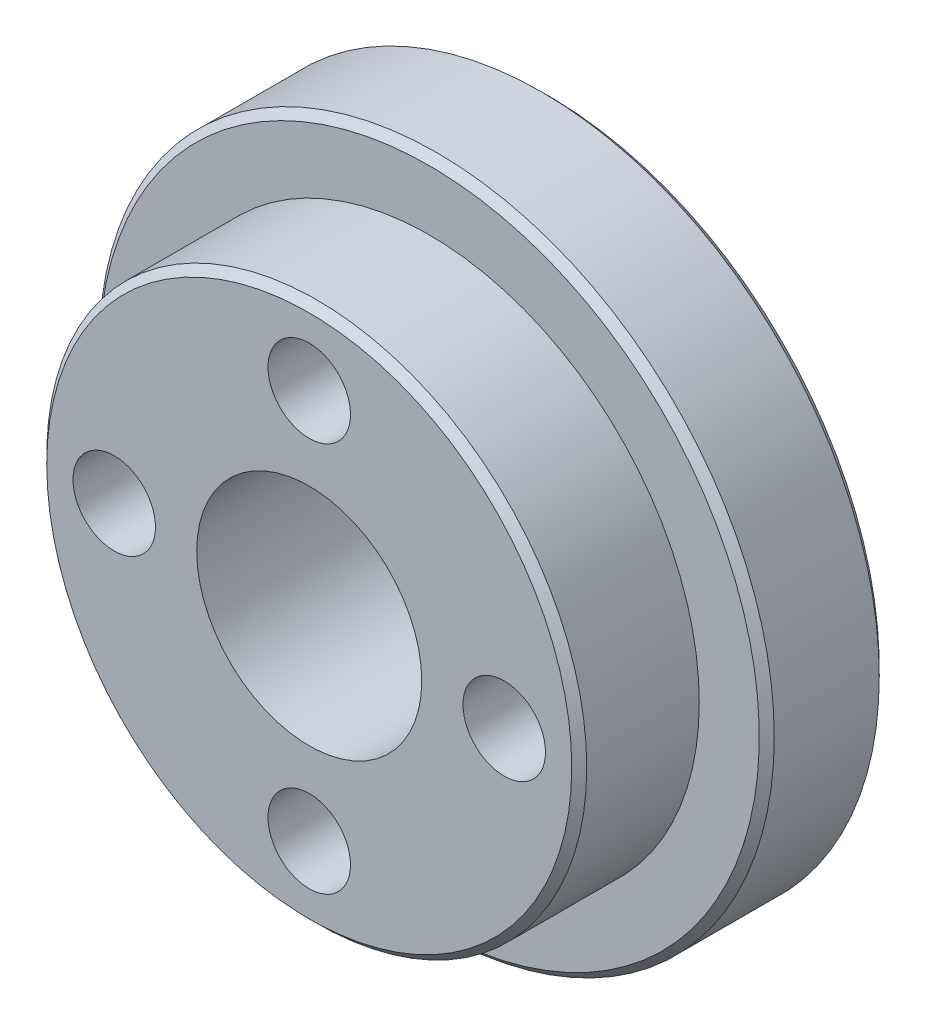
ISO-10303-21;
HEADER;
FILE_DESCRIPTION(('STEP AP214'),'2;1');
FILE_NAME('part.step','',(''),(''),'','','');
FILE_SCHEMA(('AUTOMOTIVE_DESIGN { 1 0 10303 214 1 1 1 1 }'));
ENDSEC;
DATA;
#1=APPLICATION_CONTEXT('core data for automotive mechanical design processes');
#2=APPLICATION_PROTOCOL_DEFINITION('international standard','automotive_design',2000,#1);
#3=PRODUCT_CONTEXT('',#1,'mechanical');
#4=PRODUCT('Part','Part','',(#3));
#5=PRODUCT_RELATED_PRODUCT_CATEGORY('part','',(#4));
#6=PRODUCT_DEFINITION_FORMATION('','',#4);
#7=PRODUCT_DEFINITION_CONTEXT('part definition',#1,'design');
#8=PRODUCT_DEFINITION('design','',#6,#7);
#9=PRODUCT_DEFINITION_SHAPE('','',#8);
#10=(LENGTH_UNIT() NAMED_UNIT(*) SI_UNIT(.MILLI.,.METRE.));
#11=(NAMED_UNIT(*) PLANE_ANGLE_UNIT() SI_UNIT($,.RADIAN.));
#12=(NAMED_UNIT(*) SI_UNIT($,.STERADIAN.) SOLID_ANGLE_UNIT());
#13=UNCERTAINTY_MEASURE_WITH_UNIT(LENGTH_MEASURE(1.E-05),#10,'distance_accuracy_value','');
#14=(GEOMETRIC_REPRESENTATION_CONTEXT(3) GLOBAL_UNCERTAINTY_ASSIGNED_CONTEXT((#13)) GLOBAL_UNIT_ASSIGNED_CONTEXT((#10,
#11,#12)) REPRESENTATION_CONTEXT('',''));
#15=CARTESIAN_POINT('',(0.,0.,0.));
#16=DIRECTION('',(0.,0.,1.));
#17=DIRECTION('',(1.,0.,0.));
#18=AXIS2_PLACEMENT_3D('',#15,#16,#17);
#19=CARTESIAN_POINT('',(0.,0.,8.));
#20=DIRECTION('',(0.,0.,-1.));
#21=DIRECTION('',(-1.,0.,0.));
#22=AXIS2_PLACEMENT_3D('',#19,#20,#21);
#23=CYLINDRICAL_SURFACE('',#22,18.);
#24=CARTESIAN_POINT('',(0.,0.,7.5));
#25=DIRECTION('',(0.,0.,1.));
#26=DIRECTION('',(1.,0.,0.));
#27=AXIS2_PLACEMENT_3D('',#24,#25,#26);
#28=CIRCLE('',#27,18.);
#29=CARTESIAN_POINT('',(18.,0.,7.5));
#30=VERTEX_POINT('',#29);
#31=EDGE_CURVE('E10',#30,#30,#28,.F.);
#32=ORIENTED_EDGE('',*,*,#31,.T.);
#33=EDGE_LOOP('',(#32));
#34=FACE_BOUND('',#33,.T.);
#35=CARTESIAN_POINT('',(0.,0.,0.));
#36=DIRECTION('',(0.,0.,1.));
#37=DIRECTION('',(1.,0.,0.));
#38=AXIS2_PLACEMENT_3D('',#35,#36,#37);
#39=CIRCLE('',#38,18.);
#40=CARTESIAN_POINT('',(18.,0.,0.));
#41=VERTEX_POINT('',#40);
#42=EDGE_CURVE('E63',#41,#41,#39,.T.);
#43=ORIENTED_EDGE('',*,*,#42,.T.);
#44=EDGE_LOOP('',(#43));
#45=FACE_BOUND('',#44,.T.);
#46=ADVANCED_FACE('F36',(#34,#45),#23,.T.);
#47=CARTESIAN_POINT('',(0.,0.,8.));
#48=DIRECTION('',(0.,0.,1.));
#49=DIRECTION('',(1.,0.,0.));
#50=AXIS2_PLACEMENT_3D('',#47,#48,#49);
#51=PLANE('',#50);
#52=CARTESIAN_POINT('',(-13.,1.36167772214882E-13,8.));
#53=DIRECTION('',(0.,0.,1.));
#54=DIRECTION('',(1.,0.,0.));
#55=AXIS2_PLACEMENT_3D('',#52,#53,#54);
#56=CIRCLE('',#55,2.75);
#57=CARTESIAN_POINT('',(-10.25,1.36167772214882E-13,8.));
#58=VERTEX_POINT('',#57);
#59=EDGE_CURVE('E108',#58,#58,#56,.T.);
#60=ORIENTED_EDGE('',*,*,#59,.F.);
#61=EDGE_LOOP('',(#60));
#62=FACE_BOUND('',#61,.T.);
#63=CARTESIAN_POINT('',(0.,-13.,8.));
#64=DIRECTION('',(0.,0.,1.));
#65=DIRECTION('',(1.,0.,0.));
#66=AXIS2_PLACEMENT_3D('',#63,#64,#65);
#67=CIRCLE('',#66,2.75);
#68=CARTESIAN_POINT('',(2.75,-13.,8.));
#69=VERTEX_POINT('',#68);
#70=EDGE_CURVE('E96',#69,#69,#67,.T.);
#71=ORIENTED_EDGE('',*,*,#70,.F.);
#72=EDGE_LOOP('',(#71));
#73=FACE_BOUND('',#72,.T.);
#74=CARTESIAN_POINT('',(13.,0.,8.));
#75=DIRECTION('',(0.,0.,1.));
#76=DIRECTION('',(1.,0.,0.));
#77=AXIS2_PLACEMENT_3D('',#74,#75,#76);
#78=CIRCLE('',#77,2.75);
#79=CARTESIAN_POINT('',(15.75,0.,8.));
#80=VERTEX_POINT('',#79);
#81=EDGE_CURVE('E84',#80,#80,#78,.T.);
#82=ORIENTED_EDGE('',*,*,#81,.F.);
#83=EDGE_LOOP('',(#82));
#84=FACE_BOUND('',#83,.T.);
#85=CARTESIAN_POINT('',(0.,13.,8.));
#86=DIRECTION('',(0.,0.,1.));
#87=DIRECTION('',(1.,0.,0.));
#88=AXIS2_PLACEMENT_3D('',#85,#86,#87);
#89=CIRCLE('',#88,2.75);
#90=CARTESIAN_POINT('',(2.75,13.,8.));
#91=VERTEX_POINT('',#90);
#92=EDGE_CURVE('E70',#91,#91,#89,.T.);
#93=ORIENTED_EDGE('',*,*,#92,.F.);
#94=EDGE_LOOP('',(#93));
#95=FACE_BOUND('',#94,.T.);
#96=CARTESIAN_POINT('',(0.,0.,8.));
#97=DIRECTION('',(0.,0.,-1.));
#98=DIRECTION('',(-1.,0.,0.));
#99=AXIS2_PLACEMENT_3D('',#96,#97,#98);
#100=CIRCLE('',#99,7.5);
#101=CARTESIAN_POINT('',(-7.5,0.,8.));
#102=VERTEX_POINT('',#101);
#103=EDGE_CURVE('E66',#102,#102,#100,.T.);
#104=ORIENTED_EDGE('',*,*,#103,.T.);
#105=EDGE_LOOP('',(#104));
#106=FACE_BOUND('',#105,.T.);
#107=CARTESIAN_POINT('',(0.,0.,8.));
#108=DIRECTION('',(0.,0.,1.));
#109=DIRECTION('',(1.,0.,0.));
#110=AXIS2_PLACEMENT_3D('',#107,#108,#109);
#111=CIRCLE('',#110,17.5);
#112=CARTESIAN_POINT('',(17.5,0.,8.));
#113=VERTEX_POINT('',#112);
#114=EDGE_CURVE('E44',#113,#113,#111,.T.);
#115=ORIENTED_EDGE('',*,*,#114,.T.);
#116=EDGE_LOOP('',(#115));
#117=FACE_BOUND('',#116,.T.);
#118=ADVANCED_FACE('F155',(#62,#73,#84,#95,#106,#117),#51,.T.);
#119=CARTESIAN_POINT('',(0.,0.,-8.));
#120=DIRECTION('',(0.,0.,1.));
#121=DIRECTION('',(1.,0.,0.));
#122=AXIS2_PLACEMENT_3D('',#119,#120,#121);
#123=CYLINDRICAL_SURFACE('',#122,22.5);
#124=CARTESIAN_POINT('',(0.,0.,-7.5));
#125=DIRECTION('',(0.,0.,-1.));
#126=DIRECTION('',(-1.,0.,0.));
#127=AXIS2_PLACEMENT_3D('',#124,#125,#126);
#128=CIRCLE('',#127,22.5);
#129=CARTESIAN_POINT('',(-22.5,0.,-7.5));
#130=VERTEX_POINT('',#129);
#131=EDGE_CURVE('E52',#130,#130,#128,.F.);
#132=ORIENTED_EDGE('',*,*,#131,.T.);
#133=EDGE_LOOP('',(#132));
#134=FACE_BOUND('',#133,.T.);
#135=CARTESIAN_POINT('',(0.,0.,-0.5));
#136=DIRECTION('',(0.,0.,-1.));
#137=DIRECTION('',(-1.,0.,0.));
#138=AXIS2_PLACEMENT_3D('',#135,#136,#137);
#139=CIRCLE('',#138,22.5);
#140=CARTESIAN_POINT('',(-22.5,0.,-0.5));
#141=VERTEX_POINT('',#140);
#142=EDGE_CURVE('E57',#141,#141,#139,.T.);
#143=ORIENTED_EDGE('',*,*,#142,.T.);
#144=EDGE_LOOP('',(#143));
#145=FACE_BOUND('',#144,.T.);
#146=ADVANCED_FACE('F127',(#134,#145),#123,.T.);
#147=CARTESIAN_POINT('',(0.,0.,-8.));
#148=DIRECTION('',(0.,0.,-1.));
#149=DIRECTION('',(-1.,0.,0.));
#150=AXIS2_PLACEMENT_3D('',#147,#148,#149);
#151=PLANE('',#150);
#152=CARTESIAN_POINT('',(-13.,1.36167772214882E-13,-8.));
#153=DIRECTION('',(0.,0.,-1.));
#154=DIRECTION('',(-1.,0.,0.));
#155=AXIS2_PLACEMENT_3D('',#152,#153,#154);
#156=CIRCLE('',#155,4.5);
#157=CARTESIAN_POINT('',(-17.5,1.36167772214882E-13,-8.));
#158=VERTEX_POINT('',#157);
#159=EDGE_CURVE('E117',#158,#158,#156,.T.);
#160=ORIENTED_EDGE('',*,*,#159,.F.);
#161=EDGE_LOOP('',(#160));
#162=FACE_BOUND('',#161,.T.);
#163=CARTESIAN_POINT('',(0.,-13.,-8.));
#164=DIRECTION('',(0.,0.,-1.));
#165=DIRECTION('',(-1.,0.,0.));
#166=AXIS2_PLACEMENT_3D('',#163,#164,#165);
#167=CIRCLE('',#166,4.5);
#168=CARTESIAN_POINT('',(-4.5,-13.,-8.));
#169=VERTEX_POINT('',#168);
#170=EDGE_CURVE('E105',#169,#169,#167,.T.);
#171=ORIENTED_EDGE('',*,*,#170,.F.);
#172=EDGE_LOOP('',(#171));
#173=FACE_BOUND('',#172,.T.);
#174=CARTESIAN_POINT('',(13.,0.,-8.));
#175=DIRECTION('',(0.,0.,-1.));
#176=DIRECTION('',(-1.,0.,0.));
#177=AXIS2_PLACEMENT_3D('',#174,#175,#176);
#178=CIRCLE('',#177,4.5);
#179=CARTESIAN_POINT('',(8.5,0.,-8.));
#180=VERTEX_POINT('',#179);
#181=EDGE_CURVE('E93',#180,#180,#178,.T.);
#182=ORIENTED_EDGE('',*,*,#181,.F.);
#183=EDGE_LOOP('',(#182));
#184=FACE_BOUND('',#183,.T.);
#185=CARTESIAN_POINT('',(0.,13.,-8.));
#186=DIRECTION('',(0.,0.,-1.));
#187=DIRECTION('',(-1.,0.,0.));
#188=AXIS2_PLACEMENT_3D('',#185,#186,#187);
#189=CIRCLE('',#188,4.5);
#190=CARTESIAN_POINT('',(-4.5,13.,-8.));
#191=VERTEX_POINT('',#190);
#192=EDGE_CURVE('E81',#191,#191,#189,.T.);
#193=ORIENTED_EDGE('',*,*,#192,.F.);
#194=EDGE_LOOP('',(#193));
#195=FACE_BOUND('',#194,.T.);
#196=CARTESIAN_POINT('',(0.,0.,-8.));
#197=DIRECTION('',(0.,0.,-1.));
#198=DIRECTION('',(-1.,0.,0.));
#199=AXIS2_PLACEMENT_3D('',#196,#197,#198);
#200=CIRCLE('',#199,7.5);
#201=CARTESIAN_POINT('',(-7.5,0.,-8.));
#202=VERTEX_POINT('',#201);
#203=EDGE_CURVE('E67',#202,#202,#200,.T.);
#204=ORIENTED_EDGE('',*,*,#203,.F.);
#205=EDGE_LOOP('',(#204));
#206=FACE_BOUND('',#205,.T.);
#207=CARTESIAN_POINT('',(0.,0.,-8.));
#208=DIRECTION('',(0.,0.,-1.));
#209=DIRECTION('',(-1.,0.,0.));
#210=AXIS2_PLACEMENT_3D('',#207,#208,#209);
#211=CIRCLE('',#210,22.);
#212=CARTESIAN_POINT('',(-22.,0.,-8.));
#213=VERTEX_POINT('',#212);
#214=EDGE_CURVE('E60',#213,#213,#211,.T.);
#215=ORIENTED_EDGE('',*,*,#214,.T.);
#216=EDGE_LOOP('',(#215));
#217=FACE_BOUND('',#216,.T.);
#218=ADVANCED_FACE('F123',(#162,#173,#184,#195,#206,#217),#151,.T.);
#219=CARTESIAN_POINT('',(0.,0.,0.));
#220=DIRECTION('',(0.,0.,-1.));
#221=DIRECTION('',(-1.,0.,0.));
#222=AXIS2_PLACEMENT_3D('',#219,#220,#221);
#223=PLANE('',#222);
#224=CARTESIAN_POINT('',(0.,0.,0.));
#225=DIRECTION('',(0.,0.,-1.));
#226=DIRECTION('',(-1.,0.,0.));
#227=AXIS2_PLACEMENT_3D('',#224,#225,#226);
#228=CIRCLE('',#227,22.);
#229=CARTESIAN_POINT('',(-22.,0.,0.));
#230=VERTEX_POINT('',#229);
#231=EDGE_CURVE('E48',#230,#230,#228,.F.);
#232=ORIENTED_EDGE('',*,*,#231,.T.);
#233=EDGE_LOOP('',(#232));
#234=FACE_BOUND('',#233,.T.);
#235=ORIENTED_EDGE('',*,*,#42,.F.);
#236=EDGE_LOOP('',(#235));
#237=FACE_BOUND('',#236,.T.);
#238=ADVANCED_FACE('F126',(#234,#237),#223,.F.);
#239=CARTESIAN_POINT('',(0.,0.,-8.));
#240=DIRECTION('',(0.,0.,1.));
#241=DIRECTION('',(1.,0.,0.));
#242=AXIS2_PLACEMENT_3D('',#239,#240,#241);
#243=CONICAL_SURFACE('',#242,22.,0.785398163397455);
#244=ORIENTED_EDGE('',*,*,#131,.F.);
#245=EDGE_LOOP('',(#244));
#246=FACE_BOUND('',#245,.T.);
#247=ORIENTED_EDGE('',*,*,#214,.F.);
#248=EDGE_LOOP('',(#247));
#249=FACE_BOUND('',#248,.T.);
#250=ADVANCED_FACE('F139',(#246,#249),#243,.T.);
#251=CARTESIAN_POINT('',(0.,0.,-0.5));
#252=DIRECTION('',(0.,0.,-1.));
#253=DIRECTION('',(-1.,0.,0.));
#254=AXIS2_PLACEMENT_3D('',#251,#252,#253);
#255=CONICAL_SURFACE('',#254,22.5,0.785398163397452);
#256=ORIENTED_EDGE('',*,*,#231,.F.);
#257=EDGE_LOOP('',(#256));
#258=FACE_BOUND('',#257,.T.);
#259=ORIENTED_EDGE('',*,*,#142,.F.);
#260=EDGE_LOOP('',(#259));
#261=FACE_BOUND('',#260,.T.);
#262=ADVANCED_FACE('F141',(#258,#261),#255,.T.);
#263=CARTESIAN_POINT('',(0.,0.,8.));
#264=DIRECTION('',(0.,0.,-1.));
#265=DIRECTION('',(-1.,0.,0.));
#266=AXIS2_PLACEMENT_3D('',#263,#264,#265);
#267=CONICAL_SURFACE('',#266,17.5,0.785398163397441);
#268=ORIENTED_EDGE('',*,*,#31,.F.);
#269=EDGE_LOOP('',(#268));
#270=FACE_BOUND('',#269,.T.);
#271=ORIENTED_EDGE('',*,*,#114,.F.);
#272=EDGE_LOOP('',(#271));
#273=FACE_BOUND('',#272,.T.);
#274=ADVANCED_FACE('F39',(#270,#273),#267,.T.);
#275=CARTESIAN_POINT('',(0.,0.,8.));
#276=DIRECTION('',(0.,0.,-1.));
#277=DIRECTION('',(-1.,0.,0.));
#278=AXIS2_PLACEMENT_3D('',#275,#276,#277);
#279=CYLINDRICAL_SURFACE('',#278,7.5);
#280=ORIENTED_EDGE('',*,*,#103,.F.);
#281=EDGE_LOOP('',(#280));
#282=FACE_BOUND('',#281,.T.);
#283=ORIENTED_EDGE('',*,*,#203,.T.);
#284=EDGE_LOOP('',(#283));
#285=FACE_BOUND('',#284,.T.);
#286=ADVANCED_FACE('F166',(#282,#285),#279,.F.);
#287=CARTESIAN_POINT('',(0.,13.,-8.));
#288=DIRECTION('',(0.,0.,-1.));
#289=DIRECTION('',(-1.,0.,0.));
#290=AXIS2_PLACEMENT_3D('',#287,#288,#289);
#291=CYLINDRICAL_SURFACE('',#290,2.75);
#292=CARTESIAN_POINT('',(0.,13.,-3.));
#293=DIRECTION('',(0.,0.,-1.));
#294=DIRECTION('',(-1.,0.,0.));
#295=AXIS2_PLACEMENT_3D('',#292,#293,#294);
#296=CIRCLE('',#295,2.75);
#297=CARTESIAN_POINT('',(-2.75,13.,-3.));
#298=VERTEX_POINT('',#297);
#299=EDGE_CURVE('E75',#298,#298,#296,.T.);
#300=ORIENTED_EDGE('',*,*,#299,.T.);
#301=EDGE_LOOP('',(#300));
#302=FACE_BOUND('',#301,.T.);
#303=ORIENTED_EDGE('',*,*,#92,.T.);
#304=EDGE_LOOP('',(#303));
#305=FACE_BOUND('',#304,.T.);
#306=ADVANCED_FACE('F169',(#302,#305),#291,.F.);
#307=CARTESIAN_POINT('',(2.75,13.,-3.));
#308=DIRECTION('',(0.,0.,1.));
#309=DIRECTION('',(1.,0.,0.));
#310=AXIS2_PLACEMENT_3D('',#307,#308,#309);
#311=PLANE('',#310);
#312=ORIENTED_EDGE('',*,*,#299,.F.);
#313=EDGE_LOOP('',(#312));
#314=FACE_BOUND('',#313,.T.);
#315=CARTESIAN_POINT('',(0.,13.,-3.));
#316=DIRECTION('',(0.,0.,-1.));
#317=DIRECTION('',(-1.,0.,0.));
#318=AXIS2_PLACEMENT_3D('',#315,#316,#317);
#319=CIRCLE('',#318,4.5);
#320=CARTESIAN_POINT('',(-4.5,13.,-3.));
#321=VERTEX_POINT('',#320);
#322=EDGE_CURVE('E78',#321,#321,#319,.T.);
#323=ORIENTED_EDGE('',*,*,#322,.T.);
#324=EDGE_LOOP('',(#323));
#325=FACE_BOUND('',#324,.T.);
#326=ADVANCED_FACE('F173',(#314,#325),#311,.F.);
#327=CARTESIAN_POINT('',(0.,13.,-8.));
#328=DIRECTION('',(0.,0.,-1.));
#329=DIRECTION('',(-1.,0.,0.));
#330=AXIS2_PLACEMENT_3D('',#327,#328,#329);
#331=CYLINDRICAL_SURFACE('',#330,4.5);
#332=ORIENTED_EDGE('',*,*,#322,.F.);
#333=EDGE_LOOP('',(#332));
#334=FACE_BOUND('',#333,.T.);
#335=ORIENTED_EDGE('',*,*,#192,.T.);
#336=EDGE_LOOP('',(#335));
#337=FACE_BOUND('',#336,.T.);
#338=ADVANCED_FACE('F177',(#334,#337),#331,.F.);
#339=CARTESIAN_POINT('',(13.,0.,-8.));
#340=DIRECTION('',(0.,0.,-1.));
#341=DIRECTION('',(-1.,0.,0.));
#342=AXIS2_PLACEMENT_3D('',#339,#340,#341);
#343=CYLINDRICAL_SURFACE('',#342,2.75);
#344=CARTESIAN_POINT('',(13.,0.,-3.));
#345=DIRECTION('',(0.,0.,-1.));
#346=DIRECTION('',(-1.,0.,0.));
#347=AXIS2_PLACEMENT_3D('',#344,#345,#346);
#348=CIRCLE('',#347,2.75);
#349=CARTESIAN_POINT('',(10.25,0.,-3.));
#350=VERTEX_POINT('',#349);
#351=EDGE_CURVE('E87',#350,#350,#348,.T.);
#352=ORIENTED_EDGE('',*,*,#351,.T.);
#353=EDGE_LOOP('',(#352));
#354=FACE_BOUND('',#353,.T.);
#355=ORIENTED_EDGE('',*,*,#81,.T.);
#356=EDGE_LOOP('',(#355));
#357=FACE_BOUND('',#356,.T.);
#358=ADVANCED_FACE('F181',(#354,#357),#343,.F.);
#359=CARTESIAN_POINT('',(15.75,0.,-3.));
#360=DIRECTION('',(0.,0.,1.));
#361=DIRECTION('',(1.,0.,0.));
#362=AXIS2_PLACEMENT_3D('',#359,#360,#361);
#363=PLANE('',#362);
#364=ORIENTED_EDGE('',*,*,#351,.F.);
#365=EDGE_LOOP('',(#364));
#366=FACE_BOUND('',#365,.T.);
#367=CARTESIAN_POINT('',(13.,0.,-3.));
#368=DIRECTION('',(0.,0.,-1.));
#369=DIRECTION('',(-1.,0.,0.));
#370=AXIS2_PLACEMENT_3D('',#367,#368,#369);
#371=CIRCLE('',#370,4.5);
#372=CARTESIAN_POINT('',(8.5,0.,-3.));
#373=VERTEX_POINT('',#372);
#374=EDGE_CURVE('E90',#373,#373,#371,.T.);
#375=ORIENTED_EDGE('',*,*,#374,.T.);
#376=EDGE_LOOP('',(#375));
#377=FACE_BOUND('',#376,.T.);
#378=ADVANCED_FACE('F185',(#366,#377),#363,.F.);
#379=CARTESIAN_POINT('',(13.,0.,-8.));
#380=DIRECTION('',(0.,0.,-1.));
#381=DIRECTION('',(-1.,0.,0.));
#382=AXIS2_PLACEMENT_3D('',#379,#380,#381);
#383=CYLINDRICAL_SURFACE('',#382,4.5);
#384=ORIENTED_EDGE('',*,*,#374,.F.);
#385=EDGE_LOOP('',(#384));
#386=FACE_BOUND('',#385,.T.);
#387=ORIENTED_EDGE('',*,*,#181,.T.);
#388=EDGE_LOOP('',(#387));
#389=FACE_BOUND('',#388,.T.);
#390=ADVANCED_FACE('F189',(#386,#389),#383,.F.);
#391=CARTESIAN_POINT('',(0.,-13.,-8.));
#392=DIRECTION('',(0.,0.,-1.));
#393=DIRECTION('',(-1.,0.,0.));
#394=AXIS2_PLACEMENT_3D('',#391,#392,#393);
#395=CYLINDRICAL_SURFACE('',#394,2.75);
#396=CARTESIAN_POINT('',(0.,-13.,-3.));
#397=DIRECTION('',(0.,0.,-1.));
#398=DIRECTION('',(-1.,0.,0.));
#399=AXIS2_PLACEMENT_3D('',#396,#397,#398);
#400=CIRCLE('',#399,2.75);
#401=CARTESIAN_POINT('',(-2.75,-13.,-3.));
#402=VERTEX_POINT('',#401);
#403=EDGE_CURVE('E99',#402,#402,#400,.T.);
#404=ORIENTED_EDGE('',*,*,#403,.T.);
#405=EDGE_LOOP('',(#404));
#406=FACE_BOUND('',#405,.T.);
#407=ORIENTED_EDGE('',*,*,#70,.T.);
#408=EDGE_LOOP('',(#407));
#409=FACE_BOUND('',#408,.T.);
#410=ADVANCED_FACE('F193',(#406,#409),#395,.F.);
#411=CARTESIAN_POINT('',(2.75,-13.,-3.));
#412=DIRECTION('',(0.,0.,1.));
#413=DIRECTION('',(1.,0.,0.));
#414=AXIS2_PLACEMENT_3D('',#411,#412,#413);
#415=PLANE('',#414);
#416=ORIENTED_EDGE('',*,*,#403,.F.);
#417=EDGE_LOOP('',(#416));
#418=FACE_BOUND('',#417,.T.);
#419=CARTESIAN_POINT('',(0.,-13.,-3.));
#420=DIRECTION('',(0.,0.,-1.));
#421=DIRECTION('',(-1.,0.,0.));
#422=AXIS2_PLACEMENT_3D('',#419,#420,#421);
#423=CIRCLE('',#422,4.5);
#424=CARTESIAN_POINT('',(-4.5,-13.,-3.));
#425=VERTEX_POINT('',#424);
#426=EDGE_CURVE('E102',#425,#425,#423,.T.);
#427=ORIENTED_EDGE('',*,*,#426,.T.);
#428=EDGE_LOOP('',(#427));
#429=FACE_BOUND('',#428,.T.);
#430=ADVANCED_FACE('F197',(#418,#429),#415,.F.);
#431=CARTESIAN_POINT('',(0.,-13.,-8.));
#432=DIRECTION('',(0.,0.,-1.));
#433=DIRECTION('',(-1.,0.,0.));
#434=AXIS2_PLACEMENT_3D('',#431,#432,#433);
#435=CYLINDRICAL_SURFACE('',#434,4.5);
#436=ORIENTED_EDGE('',*,*,#426,.F.);
#437=EDGE_LOOP('',(#436));
#438=FACE_BOUND('',#437,.T.);
#439=ORIENTED_EDGE('',*,*,#170,.T.);
#440=EDGE_LOOP('',(#439));
#441=FACE_BOUND('',#440,.T.);
#442=ADVANCED_FACE('F201',(#438,#441),#435,.F.);
#443=CARTESIAN_POINT('',(-13.,1.36167772214882E-13,-8.));
#444=DIRECTION('',(0.,0.,-1.));
#445=DIRECTION('',(-1.,0.,0.));
#446=AXIS2_PLACEMENT_3D('',#443,#444,#445);
#447=CYLINDRICAL_SURFACE('',#446,2.75);
#448=CARTESIAN_POINT('',(-13.,1.36167772214882E-13,-3.));
#449=DIRECTION('',(0.,0.,-1.));
#450=DIRECTION('',(-1.,0.,0.));
#451=AXIS2_PLACEMENT_3D('',#448,#449,#450);
#452=CIRCLE('',#451,2.75);
#453=CARTESIAN_POINT('',(-15.75,1.36167772214882E-13,-3.));
#454=VERTEX_POINT('',#453);
#455=EDGE_CURVE('E111',#454,#454,#452,.T.);
#456=ORIENTED_EDGE('',*,*,#455,.T.);
#457=EDGE_LOOP('',(#456));
#458=FACE_BOUND('',#457,.T.);
#459=ORIENTED_EDGE('',*,*,#59,.T.);
#460=EDGE_LOOP('',(#459));
#461=FACE_BOUND('',#460,.T.);
#462=ADVANCED_FACE('F205',(#458,#461),#447,.F.);
#463=CARTESIAN_POINT('',(-10.25,1.36167772214882E-13,-3.));
#464=DIRECTION('',(0.,0.,1.));
#465=DIRECTION('',(1.,0.,0.));
#466=AXIS2_PLACEMENT_3D('',#463,#464,#465);
#467=PLANE('',#466);
#468=ORIENTED_EDGE('',*,*,#455,.F.);
#469=EDGE_LOOP('',(#468));
#470=FACE_BOUND('',#469,.T.);
#471=CARTESIAN_POINT('',(-13.,1.36167772214882E-13,-3.));
#472=DIRECTION('',(0.,0.,-1.));
#473=DIRECTION('',(-1.,0.,0.));
#474=AXIS2_PLACEMENT_3D('',#471,#472,#473);
#475=CIRCLE('',#474,4.5);
#476=CARTESIAN_POINT('',(-17.5,1.36167772214882E-13,-3.));
#477=VERTEX_POINT('',#476);
#478=EDGE_CURVE('E114',#477,#477,#475,.T.);
#479=ORIENTED_EDGE('',*,*,#478,.T.);
#480=EDGE_LOOP('',(#479));
#481=FACE_BOUND('',#480,.T.);
#482=ADVANCED_FACE('F209',(#470,#481),#467,.F.);
#483=CARTESIAN_POINT('',(-13.,1.36167772214882E-13,-8.));
#484=DIRECTION('',(0.,0.,-1.));
#485=DIRECTION('',(-1.,0.,0.));
#486=AXIS2_PLACEMENT_3D('',#483,#484,#485);
#487=CYLINDRICAL_SURFACE('',#486,4.5);
#488=ORIENTED_EDGE('',*,*,#478,.F.);
#489=EDGE_LOOP('',(#488));
#490=FACE_BOUND('',#489,.T.);
#491=ORIENTED_EDGE('',*,*,#159,.T.);
#492=EDGE_LOOP('',(#491));
#493=FACE_BOUND('',#492,.T.);
#494=ADVANCED_FACE('F121',(#490,#493),#487,.F.);
#495=CLOSED_SHELL('',(#46,#118,#146,#218,#238,#250,#262,#274,#286,#306,#326,#338,#358,#378,#390,
#410,#430,#442,#462,#482,#494));
#496=MANIFOLD_SOLID_BREP('B2',#495);
#497=ADVANCED_BREP_SHAPE_REPRESENTATION('',(#18,#496),#14);
#498=SHAPE_DEFINITION_REPRESENTATION(#9,#497);
ENDSEC;
END-ISO-10303-21;
